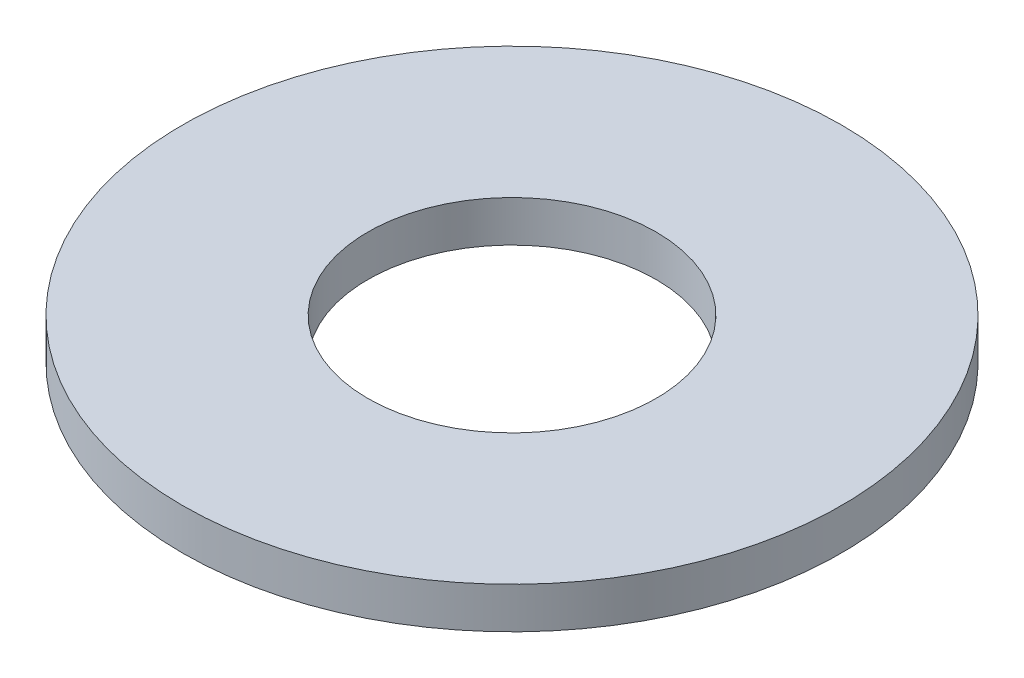
ISO-10303-21;
HEADER;
FILE_DESCRIPTION(('STEP AP214'),'2;1');
FILE_NAME('part.step','',(''),(''),'','','');
FILE_SCHEMA(('AUTOMOTIVE_DESIGN { 1 0 10303 214 1 1 1 1 }'));
ENDSEC;
DATA;
#1=APPLICATION_CONTEXT('core data for automotive mechanical design processes');
#2=APPLICATION_PROTOCOL_DEFINITION('international standard','automotive_design',2000,#1);
#3=PRODUCT_CONTEXT('',#1,'mechanical');
#4=PRODUCT('Part','Part','',(#3));
#5=PRODUCT_RELATED_PRODUCT_CATEGORY('part','',(#4));
#6=PRODUCT_DEFINITION_FORMATION('','',#4);
#7=PRODUCT_DEFINITION_CONTEXT('part definition',#1,'design');
#8=PRODUCT_DEFINITION('design','',#6,#7);
#9=PRODUCT_DEFINITION_SHAPE('','',#8);
#10=(LENGTH_UNIT() NAMED_UNIT(*) SI_UNIT(.MILLI.,.METRE.));
#11=(NAMED_UNIT(*) PLANE_ANGLE_UNIT() SI_UNIT($,.RADIAN.));
#12=(NAMED_UNIT(*) SI_UNIT($,.STERADIAN.) SOLID_ANGLE_UNIT());
#13=UNCERTAINTY_MEASURE_WITH_UNIT(LENGTH_MEASURE(1.E-05),#10,'distance_accuracy_value','');
#14=(GEOMETRIC_REPRESENTATION_CONTEXT(3) GLOBAL_UNCERTAINTY_ASSIGNED_CONTEXT((#13)) GLOBAL_UNIT_ASSIGNED_CONTEXT((#10,
#11,#12)) REPRESENTATION_CONTEXT('',''));
#15=CARTESIAN_POINT('',(0.,0.,0.));
#16=DIRECTION('',(0.,0.,1.));
#17=DIRECTION('',(1.,0.,0.));
#18=AXIS2_PLACEMENT_3D('',#15,#16,#17);
#19=CARTESIAN_POINT('',(0.,1.,0.));
#20=DIRECTION('',(0.,1.,0.));
#21=DIRECTION('',(0.,0.,1.));
#22=AXIS2_PLACEMENT_3D('',#19,#20,#21);
#23=PLANE('',#22);
#24=CARTESIAN_POINT('',(0.,1.,0.));
#25=DIRECTION('',(0.,1.,0.));
#26=DIRECTION('',(0.,0.,1.));
#27=AXIS2_PLACEMENT_3D('',#24,#25,#26);
#28=CIRCLE('',#27,8.);
#29=CARTESIAN_POINT('',(0.,1.,8.));
#30=VERTEX_POINT('',#29);
#31=EDGE_CURVE('E10',#30,#30,#28,.T.);
#32=ORIENTED_EDGE('',*,*,#31,.T.);
#33=EDGE_LOOP('',(#32));
#34=FACE_BOUND('',#33,.T.);
#35=CARTESIAN_POINT('',(0.,1.,0.));
#36=DIRECTION('',(0.,1.,0.));
#37=DIRECTION('',(0.,0.,1.));
#38=AXIS2_PLACEMENT_3D('',#35,#36,#37);
#39=CIRCLE('',#38,3.5);
#40=CARTESIAN_POINT('',(0.,1.,3.5));
#41=VERTEX_POINT('',#40);
#42=EDGE_CURVE('E41',#41,#41,#39,.T.);
#43=ORIENTED_EDGE('',*,*,#42,.F.);
#44=EDGE_LOOP('',(#43));
#45=FACE_BOUND('',#44,.T.);
#46=ADVANCED_FACE('F30',(#34,#45),#23,.T.);
#47=CARTESIAN_POINT('',(0.,0.,0.));
#48=DIRECTION('',(0.,1.,0.));
#49=DIRECTION('',(0.,0.,1.));
#50=AXIS2_PLACEMENT_3D('',#47,#48,#49);
#51=PLANE('',#50);
#52=CARTESIAN_POINT('',(0.,0.,0.));
#53=DIRECTION('',(0.,1.,0.));
#54=DIRECTION('',(0.,0.,1.));
#55=AXIS2_PLACEMENT_3D('',#52,#53,#54);
#56=CIRCLE('',#55,8.);
#57=CARTESIAN_POINT('',(0.,0.,8.));
#58=VERTEX_POINT('',#57);
#59=EDGE_CURVE('E34',#58,#58,#56,.T.);
#60=ORIENTED_EDGE('',*,*,#59,.F.);
#61=EDGE_LOOP('',(#60));
#62=FACE_BOUND('',#61,.T.);
#63=CARTESIAN_POINT('',(0.,0.,0.));
#64=DIRECTION('',(0.,1.,0.));
#65=DIRECTION('',(0.,0.,1.));
#66=AXIS2_PLACEMENT_3D('',#63,#64,#65);
#67=CIRCLE('',#66,3.5);
#68=CARTESIAN_POINT('',(0.,0.,3.5));
#69=VERTEX_POINT('',#68);
#70=EDGE_CURVE('E43',#69,#69,#67,.T.);
#71=ORIENTED_EDGE('',*,*,#70,.T.);
#72=EDGE_LOOP('',(#71));
#73=FACE_BOUND('',#72,.T.);
#74=ADVANCED_FACE('F53',(#62,#73),#51,.F.);
#75=CARTESIAN_POINT('',(0.,1.,0.));
#76=DIRECTION('',(0.,-1.,0.));
#77=DIRECTION('',(0.,0.,-1.));
#78=AXIS2_PLACEMENT_3D('',#75,#76,#77);
#79=CYLINDRICAL_SURFACE('',#78,8.);
#80=ORIENTED_EDGE('',*,*,#31,.F.);
#81=EDGE_LOOP('',(#80));
#82=FACE_BOUND('',#81,.T.);
#83=ORIENTED_EDGE('',*,*,#59,.T.);
#84=EDGE_LOOP('',(#83));
#85=FACE_BOUND('',#84,.T.);
#86=ADVANCED_FACE('F32',(#82,#85),#79,.T.);
#87=CARTESIAN_POINT('',(0.,1.,0.));
#88=DIRECTION('',(0.,-1.,0.));
#89=DIRECTION('',(0.,0.,-1.));
#90=AXIS2_PLACEMENT_3D('',#87,#88,#89);
#91=CYLINDRICAL_SURFACE('',#90,3.5);
#92=ORIENTED_EDGE('',*,*,#42,.T.);
#93=EDGE_LOOP('',(#92));
#94=FACE_BOUND('',#93,.T.);
#95=ORIENTED_EDGE('',*,*,#70,.F.);
#96=EDGE_LOOP('',(#95));
#97=FACE_BOUND('',#96,.T.);
#98=ADVANCED_FACE('F49',(#94,#97),#91,.F.);
#99=CLOSED_SHELL('',(#46,#74,#86,#98));
#100=MANIFOLD_SOLID_BREP('B2',#99);
#101=ADVANCED_BREP_SHAPE_REPRESENTATION('',(#18,#100),#14);
#102=SHAPE_DEFINITION_REPRESENTATION(#9,#101);
ENDSEC;
END-ISO-10303-21;
